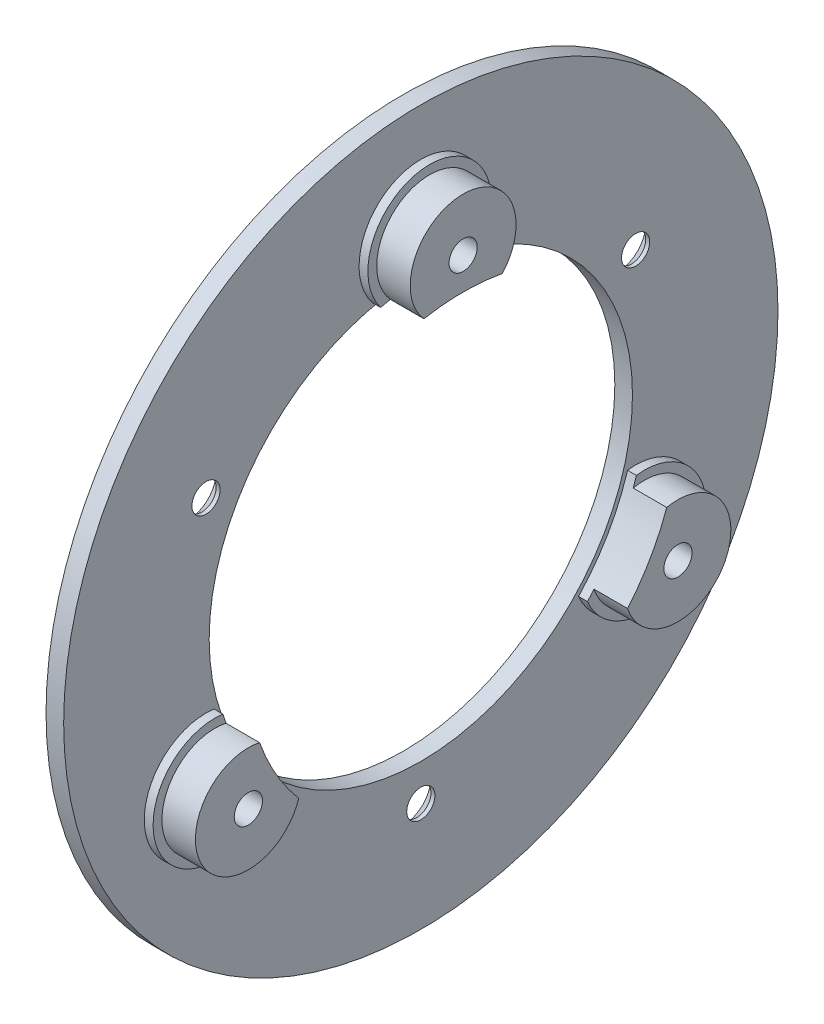
ISO-10303-21;
HEADER;
FILE_DESCRIPTION(('STEP AP214'),'2;1');
FILE_NAME('part.step','',(''),(''),'','','');
FILE_SCHEMA(('AUTOMOTIVE_DESIGN { 1 0 10303 214 1 1 1 1 }'));
ENDSEC;
DATA;
#1=APPLICATION_CONTEXT('core data for automotive mechanical design processes');
#2=APPLICATION_PROTOCOL_DEFINITION('international standard','automotive_design',2000,#1);
#3=PRODUCT_CONTEXT('',#1,'mechanical');
#4=PRODUCT('Part','Part','',(#3));
#5=PRODUCT_RELATED_PRODUCT_CATEGORY('part','',(#4));
#6=PRODUCT_DEFINITION_FORMATION('','',#4);
#7=PRODUCT_DEFINITION_CONTEXT('part definition',#1,'design');
#8=PRODUCT_DEFINITION('design','',#6,#7);
#9=PRODUCT_DEFINITION_SHAPE('','',#8);
#10=(LENGTH_UNIT() NAMED_UNIT(*) SI_UNIT(.MILLI.,.METRE.));
#11=(NAMED_UNIT(*) PLANE_ANGLE_UNIT() SI_UNIT($,.RADIAN.));
#12=(NAMED_UNIT(*) SI_UNIT($,.STERADIAN.) SOLID_ANGLE_UNIT());
#13=UNCERTAINTY_MEASURE_WITH_UNIT(LENGTH_MEASURE(1.E-05),#10,'distance_accuracy_value','');
#14=(GEOMETRIC_REPRESENTATION_CONTEXT(3) GLOBAL_UNCERTAINTY_ASSIGNED_CONTEXT((#13)) GLOBAL_UNIT_ASSIGNED_CONTEXT((#10,
#11,#12)) REPRESENTATION_CONTEXT('',''));
#15=CARTESIAN_POINT('',(0.,0.,0.));
#16=DIRECTION('',(0.,0.,1.));
#17=DIRECTION('',(1.,0.,0.));
#18=AXIS2_PLACEMENT_3D('',#15,#16,#17);
#19=CARTESIAN_POINT('',(-69.2964645562817,0.,0.));
#20=DIRECTION('',(1.,0.,0.));
#21=DIRECTION('',(0.,0.,-1.));
#22=AXIS2_PLACEMENT_3D('',#19,#20,#21);
#23=CYLINDRICAL_SURFACE('',#22,24.);
#24=CARTESIAN_POINT('',(0.,0.,0.));
#25=DIRECTION('',(-1.,0.,0.));
#26=DIRECTION('',(0.,0.,1.));
#27=AXIS2_PLACEMENT_3D('',#24,#25,#26);
#28=CIRCLE('',#27,24.);
#29=CARTESIAN_POINT('',(0.,0.,24.));
#30=VERTEX_POINT('',#29);
#31=EDGE_CURVE('E173',#30,#30,#28,.F.);
#32=ORIENTED_EDGE('',*,*,#31,.F.);
#33=EDGE_LOOP('',(#32));
#34=FACE_BOUND('',#33,.T.);
#35=CARTESIAN_POINT('',(2.,0.,0.));
#36=DIRECTION('',(1.,0.,0.));
#37=DIRECTION('',(0.,0.,-1.));
#38=AXIS2_PLACEMENT_3D('',#35,#36,#37);
#39=CIRCLE('',#38,24.);
#40=CARTESIAN_POINT('',(2.,0.,-24.));
#41=VERTEX_POINT('',#40);
#42=EDGE_CURVE('E265',#41,#41,#39,.F.);
#43=ORIENTED_EDGE('',*,*,#42,.F.);
#44=EDGE_LOOP('',(#43));
#45=FACE_BOUND('',#44,.T.);
#46=ADVANCED_FACE('F164',(#34,#45),#23,.F.);
#47=CARTESIAN_POINT('',(3.,14.0625,0.));
#48=DIRECTION('',(1.,0.,0.));
#49=DIRECTION('',(0.,0.,-1.));
#50=AXIS2_PLACEMENT_3D('',#47,#48,#49);
#51=PLANE('',#50);
#52=CARTESIAN_POINT('',(3.,-14.0625,-24.3569644814373));
#53=DIRECTION('',(1.,0.,0.));
#54=DIRECTION('',(0.,0.,-1.));
#55=AXIS2_PLACEMENT_3D('',#52,#53,#54);
#56=CIRCLE('',#55,7.);
#57=CARTESIAN_POINT('',(3.,-16.7399213666563,-17.8892434898227));
#58=VERTEX_POINT('',#57);
#59=CARTESIAN_POINT('',(3.,-7.12257863334373,-23.4418189057896));
#60=VERTEX_POINT('',#59);
#61=EDGE_CURVE('E288',#58,#60,#56,.T.);
#62=ORIENTED_EDGE('',*,*,#61,.T.);
#63=CARTESIAN_POINT('',(3.,0.,0.));
#64=DIRECTION('',(1.,0.,0.));
#65=DIRECTION('',(0.,0.,-1.));
#66=AXIS2_PLACEMENT_3D('',#63,#64,#65);
#67=CIRCLE('',#66,24.5);
#68=CARTESIAN_POINT('',(3.,-8.19830874252486,-23.0876099621039));
#69=VERTEX_POINT('',#68);
#70=EDGE_CURVE('E402',#60,#69,#67,.F.);
#71=ORIENTED_EDGE('',*,*,#70,.T.);
#72=CARTESIAN_POINT('',(3.,-14.0625,-24.3569644814373));
#73=DIRECTION('',(1.,0.,0.));
#74=DIRECTION('',(0.,0.,-1.));
#75=AXIS2_PLACEMENT_3D('',#72,#73,#74);
#76=CIRCLE('',#75,6.);
#77=CARTESIAN_POINT('',(3.,-15.8953023685863,-18.6437486201465));
#78=VERTEX_POINT('',#77);
#79=EDGE_CURVE('E285',#78,#69,#76,.T.);
#80=ORIENTED_EDGE('',*,*,#79,.F.);
#81=EDGE_CURVE('E405',#78,#58,#67,.F.);
#82=ORIENTED_EDGE('',*,*,#81,.T.);
#83=EDGE_LOOP('',(#62,#71,#80,#82));
#84=FACE_BOUND('',#83,.T.);
#85=ADVANCED_FACE('F393',(#84),#51,.T.);
#86=CARTESIAN_POINT('',(3.,-14.0625,24.3569644814373));
#87=DIRECTION('',(1.,0.,0.));
#88=DIRECTION('',(0.,0.,-1.));
#89=AXIS2_PLACEMENT_3D('',#86,#87,#88);
#90=CIRCLE('',#89,7.);
#91=CARTESIAN_POINT('',(3.,-7.12257863334372,23.4418189057896));
#92=VERTEX_POINT('',#91);
#93=CARTESIAN_POINT('',(3.,-16.7399213666563,17.8892434898227));
#94=VERTEX_POINT('',#93);
#95=EDGE_CURVE('E410',#92,#94,#90,.T.);
#96=ORIENTED_EDGE('',*,*,#95,.T.);
#97=CARTESIAN_POINT('',(3.,-15.8953023685863,18.6437486201465));
#98=VERTEX_POINT('',#97);
#99=EDGE_CURVE('E437',#94,#98,#67,.F.);
#100=ORIENTED_EDGE('',*,*,#99,.T.);
#101=CARTESIAN_POINT('',(3.,-14.0625,24.3569644814373));
#102=DIRECTION('',(1.,0.,0.));
#103=DIRECTION('',(0.,0.,-1.));
#104=AXIS2_PLACEMENT_3D('',#101,#102,#103);
#105=CIRCLE('',#104,6.);
#106=CARTESIAN_POINT('',(3.,-8.19830874252487,23.0876099621039));
#107=VERTEX_POINT('',#106);
#108=EDGE_CURVE('E404',#107,#98,#105,.T.);
#109=ORIENTED_EDGE('',*,*,#108,.F.);
#110=EDGE_CURVE('E434',#107,#92,#67,.F.);
#111=ORIENTED_EDGE('',*,*,#110,.T.);
#112=EDGE_LOOP('',(#96,#100,#109,#111));
#113=FACE_BOUND('',#112,.T.);
#114=ADVANCED_FACE('F436',(#113),#51,.T.);
#115=CARTESIAN_POINT('',(3.,28.125,0.));
#116=DIRECTION('',(1.,0.,0.));
#117=DIRECTION('',(0.,0.,-1.));
#118=AXIS2_PLACEMENT_3D('',#115,#116,#117);
#119=CIRCLE('',#118,7.);
#120=CARTESIAN_POINT('',(3.,23.8625,-5.5525754159669));
#121=VERTEX_POINT('',#120);
#122=CARTESIAN_POINT('',(3.,23.8625,5.5525754159669));
#123=VERTEX_POINT('',#122);
#124=EDGE_CURVE('E273',#121,#123,#119,.T.);
#125=ORIENTED_EDGE('',*,*,#124,.T.);
#126=CARTESIAN_POINT('',(3.,24.0936111111111,4.44386134195738));
#127=VERTEX_POINT('',#126);
#128=EDGE_CURVE('E400',#123,#127,#67,.F.);
#129=ORIENTED_EDGE('',*,*,#128,.T.);
#130=CARTESIAN_POINT('',(3.,28.125,0.));
#131=DIRECTION('',(1.,0.,0.));
#132=DIRECTION('',(0.,0.,-1.));
#133=AXIS2_PLACEMENT_3D('',#130,#131,#132);
#134=CIRCLE('',#133,6.);
#135=CARTESIAN_POINT('',(3.,24.0936111111111,-4.44386134195738));
#136=VERTEX_POINT('',#135);
#137=EDGE_CURVE('E279',#136,#127,#134,.T.);
#138=ORIENTED_EDGE('',*,*,#137,.F.);
#139=EDGE_CURVE('E398',#136,#121,#67,.F.);
#140=ORIENTED_EDGE('',*,*,#139,.T.);
#141=EDGE_LOOP('',(#125,#129,#138,#140));
#142=FACE_BOUND('',#141,.T.);
#143=ADVANCED_FACE('F440',(#142),#51,.T.);
#144=CARTESIAN_POINT('',(2.,0.,0.));
#145=DIRECTION('',(1.,0.,0.));
#146=DIRECTION('',(0.,0.,-1.));
#147=AXIS2_PLACEMENT_3D('',#144,#145,#146);
#148=PLANE('',#147);
#149=CARTESIAN_POINT('',(2.,28.125,0.));
#150=DIRECTION('',(1.,0.,0.));
#151=DIRECTION('',(0.,0.,-1.));
#152=AXIS2_PLACEMENT_3D('',#149,#150,#151);
#153=CIRCLE('',#152,7.);
#154=CARTESIAN_POINT('',(2.,23.8625,-5.5525754159669));
#155=VERTEX_POINT('',#154);
#156=CARTESIAN_POINT('',(2.,23.8625,5.5525754159669));
#157=VERTEX_POINT('',#156);
#158=EDGE_CURVE('E271',#155,#157,#153,.T.);
#159=ORIENTED_EDGE('',*,*,#158,.F.);
#160=CARTESIAN_POINT('',(2.,0.,0.));
#161=DIRECTION('',(1.,0.,0.));
#162=DIRECTION('',(0.,0.,-1.));
#163=AXIS2_PLACEMENT_3D('',#160,#161,#162);
#164=CIRCLE('',#163,24.5);
#165=EDGE_CURVE('E254',#155,#157,#164,.T.);
#166=ORIENTED_EDGE('',*,*,#165,.T.);
#167=EDGE_LOOP('',(#159,#166));
#168=FACE_BOUND('',#167,.T.);
#169=CARTESIAN_POINT('',(2.,-14.0625,24.3569644814373));
#170=DIRECTION('',(1.,0.,0.));
#171=DIRECTION('',(0.,0.,-1.));
#172=AXIS2_PLACEMENT_3D('',#169,#170,#171);
#173=CIRCLE('',#172,7.);
#174=CARTESIAN_POINT('',(2.,-7.12257863334373,23.4418189057896));
#175=VERTEX_POINT('',#174);
#176=CARTESIAN_POINT('',(2.,-16.7399213666563,17.8892434898227));
#177=VERTEX_POINT('',#176);
#178=EDGE_CURVE('E278',#175,#177,#173,.T.);
#179=ORIENTED_EDGE('',*,*,#178,.F.);
#180=EDGE_CURVE('E266',#175,#177,#164,.T.);
#181=ORIENTED_EDGE('',*,*,#180,.T.);
#182=EDGE_LOOP('',(#179,#181));
#183=FACE_BOUND('',#182,.T.);
#184=CARTESIAN_POINT('',(2.,14.0624999999999,24.3569644814374));
#185=DIRECTION('',(1.,0.,0.));
#186=DIRECTION('',(0.,0.,-1.));
#187=AXIS2_PLACEMENT_3D('',#184,#185,#186);
#188=CIRCLE('',#187,1.59999999999999);
#189=CARTESIAN_POINT('',(2.,14.0624999999999,22.7569644814374));
#190=VERTEX_POINT('',#189);
#191=EDGE_CURVE('E348',#190,#190,#188,.F.);
#192=ORIENTED_EDGE('',*,*,#191,.T.);
#193=EDGE_LOOP('',(#192));
#194=FACE_BOUND('',#193,.T.);
#195=CARTESIAN_POINT('',(2.,-28.125,0.));
#196=DIRECTION('',(1.,0.,0.));
#197=DIRECTION('',(0.,0.,-1.));
#198=AXIS2_PLACEMENT_3D('',#195,#196,#197);
#199=CIRCLE('',#198,1.59999999999999);
#200=CARTESIAN_POINT('',(2.,-28.125,-1.59999999999999));
#201=VERTEX_POINT('',#200);
#202=EDGE_CURVE('E345',#201,#201,#199,.F.);
#203=ORIENTED_EDGE('',*,*,#202,.T.);
#204=EDGE_LOOP('',(#203));
#205=FACE_BOUND('',#204,.T.);
#206=CARTESIAN_POINT('',(2.,14.0625000000003,-24.3569644814372));
#207=DIRECTION('',(1.,0.,0.));
#208=DIRECTION('',(0.,0.,-1.));
#209=AXIS2_PLACEMENT_3D('',#206,#207,#208);
#210=CIRCLE('',#209,1.59999999999999);
#211=CARTESIAN_POINT('',(2.,14.0625000000003,-25.9569644814372));
#212=VERTEX_POINT('',#211);
#213=EDGE_CURVE('E168',#212,#212,#210,.F.);
#214=ORIENTED_EDGE('',*,*,#213,.T.);
#215=EDGE_LOOP('',(#214));
#216=FACE_BOUND('',#215,.T.);
#217=CARTESIAN_POINT('',(2.,0.,0.));
#218=DIRECTION('',(1.,0.,0.));
#219=DIRECTION('',(0.,0.,-1.));
#220=AXIS2_PLACEMENT_3D('',#217,#218,#219);
#221=CIRCLE('',#220,40.5);
#222=CARTESIAN_POINT('',(2.,0.,-40.5));
#223=VERTEX_POINT('',#222);
#224=EDGE_CURVE('E342',#223,#223,#221,.T.);
#225=ORIENTED_EDGE('',*,*,#224,.T.);
#226=EDGE_LOOP('',(#225));
#227=FACE_BOUND('',#226,.T.);
#228=CARTESIAN_POINT('',(2.,-16.7399213666563,-17.8892434898227));
#229=VERTEX_POINT('',#228);
#230=CARTESIAN_POINT('',(2.,-7.12257863334373,-23.4418189057896));
#231=VERTEX_POINT('',#230);
#232=EDGE_CURVE('E180',#229,#231,#164,.T.);
#233=ORIENTED_EDGE('',*,*,#232,.T.);
#234=CARTESIAN_POINT('',(2.,-14.0625,-24.3569644814373));
#235=DIRECTION('',(1.,0.,0.));
#236=DIRECTION('',(0.,0.,-1.));
#237=AXIS2_PLACEMENT_3D('',#234,#235,#236);
#238=CIRCLE('',#237,7.);
#239=EDGE_CURVE('E282',#229,#231,#238,.T.);
#240=ORIENTED_EDGE('',*,*,#239,.F.);
#241=EDGE_LOOP('',(#233,#240));
#242=FACE_BOUND('',#241,.T.);
#243=ORIENTED_EDGE('',*,*,#42,.T.);
#244=EDGE_LOOP('',(#243));
#245=FACE_BOUND('',#244,.T.);
#246=ADVANCED_FACE('F276',(#168,#183,#194,#205,#216,#227,#242,#245),#148,.T.);
#247=CARTESIAN_POINT('',(3.,0.,0.));
#248=DIRECTION('',(-1.,0.,0.));
#249=DIRECTION('',(0.,0.,1.));
#250=AXIS2_PLACEMENT_3D('',#247,#248,#249);
#251=CYLINDRICAL_SURFACE('',#250,40.5);
#252=CARTESIAN_POINT('',(0.,0.,0.));
#253=DIRECTION('',(-1.,0.,0.));
#254=DIRECTION('',(0.,0.,1.));
#255=AXIS2_PLACEMENT_3D('',#252,#253,#254);
#256=CIRCLE('',#255,40.5);
#257=CARTESIAN_POINT('',(0.,0.,40.5));
#258=VERTEX_POINT('',#257);
#259=EDGE_CURVE('E12',#258,#258,#256,.T.);
#260=ORIENTED_EDGE('',*,*,#259,.F.);
#261=EDGE_LOOP('',(#260));
#262=FACE_BOUND('',#261,.T.);
#263=ORIENTED_EDGE('',*,*,#224,.F.);
#264=EDGE_LOOP('',(#263));
#265=FACE_BOUND('',#264,.T.);
#266=ADVANCED_FACE('F452',(#262,#265),#251,.T.);
#267=CARTESIAN_POINT('',(0.,28.125,0.));
#268=DIRECTION('',(-1.,0.,0.));
#269=DIRECTION('',(0.,0.,1.));
#270=AXIS2_PLACEMENT_3D('',#267,#268,#269);
#271=CYLINDRICAL_SURFACE('',#270,1.59999999999999);
#272=CARTESIAN_POINT('',(1.55,28.125,0.));
#273=DIRECTION('',(-1.,0.,0.));
#274=DIRECTION('',(0.,0.,1.));
#275=AXIS2_PLACEMENT_3D('',#272,#273,#274);
#276=CIRCLE('',#275,1.59999999999999);
#277=CARTESIAN_POINT('',(1.55,28.125,1.59999999999999));
#278=VERTEX_POINT('',#277);
#279=EDGE_CURVE('E382',#278,#278,#276,.T.);
#280=ORIENTED_EDGE('',*,*,#279,.T.);
#281=EDGE_LOOP('',(#280));
#282=FACE_BOUND('',#281,.T.);
#283=CARTESIAN_POINT('',(6.8,28.125,0.));
#284=DIRECTION('',(1.,0.,0.));
#285=DIRECTION('',(0.,0.,-1.));
#286=AXIS2_PLACEMENT_3D('',#283,#284,#285);
#287=CIRCLE('',#286,1.59999999999999);
#288=CARTESIAN_POINT('',(6.8,28.125,-1.59999999999999));
#289=VERTEX_POINT('',#288);
#290=EDGE_CURVE('E334',#289,#289,#287,.F.);
#291=ORIENTED_EDGE('',*,*,#290,.F.);
#292=EDGE_LOOP('',(#291));
#293=FACE_BOUND('',#292,.T.);
#294=ADVANCED_FACE('F449',(#282,#293),#271,.F.);
#295=CARTESIAN_POINT('',(0.,14.0624999999999,24.3569644814374));
#296=DIRECTION('',(-1.,0.,0.));
#297=DIRECTION('',(0.,0.,1.));
#298=AXIS2_PLACEMENT_3D('',#295,#296,#297);
#299=CYLINDRICAL_SURFACE('',#298,1.59999999999999);
#300=CARTESIAN_POINT('',(1.55,14.0624999999999,24.3569644814374));
#301=DIRECTION('',(-1.,0.,0.));
#302=DIRECTION('',(0.,0.,1.));
#303=AXIS2_PLACEMENT_3D('',#300,#301,#302);
#304=CIRCLE('',#303,1.59999999999999);
#305=CARTESIAN_POINT('',(1.55,14.0624999999999,25.9569644814374));
#306=VERTEX_POINT('',#305);
#307=EDGE_CURVE('E376',#306,#306,#304,.T.);
#308=ORIENTED_EDGE('',*,*,#307,.T.);
#309=EDGE_LOOP('',(#308));
#310=FACE_BOUND('',#309,.T.);
#311=ORIENTED_EDGE('',*,*,#191,.F.);
#312=EDGE_LOOP('',(#311));
#313=FACE_BOUND('',#312,.T.);
#314=ADVANCED_FACE('F451',(#310,#313),#299,.F.);
#315=CARTESIAN_POINT('',(0.,-14.0625000000001,24.3569644814373));
#316=DIRECTION('',(-1.,0.,0.));
#317=DIRECTION('',(0.,0.,1.));
#318=AXIS2_PLACEMENT_3D('',#315,#316,#317);
#319=CYLINDRICAL_SURFACE('',#318,1.59999999999999);
#320=CARTESIAN_POINT('',(1.55,-14.0625000000001,24.3569644814373));
#321=DIRECTION('',(-1.,0.,0.));
#322=DIRECTION('',(0.,0.,1.));
#323=AXIS2_PLACEMENT_3D('',#320,#321,#322);
#324=CIRCLE('',#323,1.59999999999999);
#325=CARTESIAN_POINT('',(1.55,-14.0625000000001,25.9569644814373));
#326=VERTEX_POINT('',#325);
#327=EDGE_CURVE('E370',#326,#326,#324,.T.);
#328=ORIENTED_EDGE('',*,*,#327,.T.);
#329=EDGE_LOOP('',(#328));
#330=FACE_BOUND('',#329,.T.);
#331=CARTESIAN_POINT('',(6.8,-14.0625000000001,24.3569644814373));
#332=DIRECTION('',(1.,0.,0.));
#333=DIRECTION('',(0.,0.,-1.));
#334=AXIS2_PLACEMENT_3D('',#331,#332,#333);
#335=CIRCLE('',#334,1.59999999999999);
#336=CARTESIAN_POINT('',(6.8,-14.0625000000001,22.7569644814373));
#337=VERTEX_POINT('',#336);
#338=EDGE_CURVE('E321',#337,#337,#335,.F.);
#339=ORIENTED_EDGE('',*,*,#338,.F.);
#340=EDGE_LOOP('',(#339));
#341=FACE_BOUND('',#340,.T.);
#342=ADVANCED_FACE('F459',(#330,#341),#319,.F.);
#343=CARTESIAN_POINT('',(0.,-28.125,0.));
#344=DIRECTION('',(-1.,0.,0.));
#345=DIRECTION('',(0.,0.,1.));
#346=AXIS2_PLACEMENT_3D('',#343,#344,#345);
#347=CYLINDRICAL_SURFACE('',#346,1.59999999999999);
#348=CARTESIAN_POINT('',(1.55,-28.125,0.));
#349=DIRECTION('',(-1.,0.,0.));
#350=DIRECTION('',(0.,0.,1.));
#351=AXIS2_PLACEMENT_3D('',#348,#349,#350);
#352=CIRCLE('',#351,1.59999999999999);
#353=CARTESIAN_POINT('',(1.55,-28.125,1.59999999999999));
#354=VERTEX_POINT('',#353);
#355=EDGE_CURVE('E364',#354,#354,#352,.T.);
#356=ORIENTED_EDGE('',*,*,#355,.T.);
#357=EDGE_LOOP('',(#356));
#358=FACE_BOUND('',#357,.T.);
#359=ORIENTED_EDGE('',*,*,#202,.F.);
#360=EDGE_LOOP('',(#359));
#361=FACE_BOUND('',#360,.T.);
#362=ADVANCED_FACE('F506',(#358,#361),#347,.F.);
#363=CARTESIAN_POINT('',(0.,-14.0624999999998,-24.3569644814375));
#364=DIRECTION('',(-1.,0.,0.));
#365=DIRECTION('',(0.,0.,1.));
#366=AXIS2_PLACEMENT_3D('',#363,#364,#365);
#367=CYLINDRICAL_SURFACE('',#366,1.59999999999999);
#368=CARTESIAN_POINT('',(1.55,-14.0624999999998,-24.3569644814375));
#369=DIRECTION('',(-1.,0.,0.));
#370=DIRECTION('',(0.,0.,1.));
#371=AXIS2_PLACEMENT_3D('',#368,#369,#370);
#372=CIRCLE('',#371,1.59999999999999);
#373=CARTESIAN_POINT('',(1.55,-14.0624999999998,-22.7569644814375));
#374=VERTEX_POINT('',#373);
#375=EDGE_CURVE('E358',#374,#374,#372,.T.);
#376=ORIENTED_EDGE('',*,*,#375,.T.);
#377=EDGE_LOOP('',(#376));
#378=FACE_BOUND('',#377,.T.);
#379=CARTESIAN_POINT('',(6.8,-14.0624999999998,-24.3569644814375));
#380=DIRECTION('',(1.,0.,0.));
#381=DIRECTION('',(0.,0.,-1.));
#382=AXIS2_PLACEMENT_3D('',#379,#380,#381);
#383=CIRCLE('',#382,1.59999999999999);
#384=CARTESIAN_POINT('',(6.8,-14.0624999999998,-25.9569644814375));
#385=VERTEX_POINT('',#384);
#386=EDGE_CURVE('E307',#385,#385,#383,.F.);
#387=ORIENTED_EDGE('',*,*,#386,.F.);
#388=EDGE_LOOP('',(#387));
#389=FACE_BOUND('',#388,.T.);
#390=ADVANCED_FACE('F497',(#378,#389),#367,.F.);
#391=CARTESIAN_POINT('',(0.,14.0625000000003,-24.3569644814372));
#392=DIRECTION('',(-1.,0.,0.));
#393=DIRECTION('',(0.,0.,1.));
#394=AXIS2_PLACEMENT_3D('',#391,#392,#393);
#395=CYLINDRICAL_SURFACE('',#394,1.59999999999999);
#396=CARTESIAN_POINT('',(1.55,14.0625000000003,-24.3569644814372));
#397=DIRECTION('',(-1.,0.,0.));
#398=DIRECTION('',(0.,0.,1.));
#399=AXIS2_PLACEMENT_3D('',#396,#397,#398);
#400=CIRCLE('',#399,1.59999999999999);
#401=CARTESIAN_POINT('',(1.55,14.0625000000003,-22.7569644814372));
#402=VERTEX_POINT('',#401);
#403=EDGE_CURVE('E352',#402,#402,#400,.T.);
#404=ORIENTED_EDGE('',*,*,#403,.T.);
#405=EDGE_LOOP('',(#404));
#406=FACE_BOUND('',#405,.T.);
#407=ORIENTED_EDGE('',*,*,#213,.F.);
#408=EDGE_LOOP('',(#407));
#409=FACE_BOUND('',#408,.T.);
#410=ADVANCED_FACE('F475',(#406,#409),#395,.F.);
#411=CARTESIAN_POINT('',(0.,36.25,0.));
#412=DIRECTION('',(-1.,0.,0.));
#413=DIRECTION('',(0.,-1.,0.));
#414=AXIS2_PLACEMENT_3D('',#411,#412,#413);
#415=PLANE('',#414);
#416=CARTESIAN_POINT('',(0.,14.0625000000003,-24.3569644814372));
#417=DIRECTION('',(-1.,0.,0.));
#418=DIRECTION('',(0.,0.,1.));
#419=AXIS2_PLACEMENT_3D('',#416,#417,#418);
#420=CIRCLE('',#419,3.15);
#421=CARTESIAN_POINT('',(0.,14.0625000000003,-21.2069644814372));
#422=VERTEX_POINT('',#421);
#423=EDGE_CURVE('E351',#422,#422,#420,.T.);
#424=ORIENTED_EDGE('',*,*,#423,.F.);
#425=EDGE_LOOP('',(#424));
#426=FACE_BOUND('',#425,.T.);
#427=CARTESIAN_POINT('',(0.,-14.0624999999998,-24.3569644814375));
#428=DIRECTION('',(-1.,0.,0.));
#429=DIRECTION('',(0.,0.,1.));
#430=AXIS2_PLACEMENT_3D('',#427,#428,#429);
#431=CIRCLE('',#430,3.15);
#432=CARTESIAN_POINT('',(0.,-14.0624999999998,-21.2069644814375));
#433=VERTEX_POINT('',#432);
#434=EDGE_CURVE('E355',#433,#433,#431,.T.);
#435=ORIENTED_EDGE('',*,*,#434,.F.);
#436=EDGE_LOOP('',(#435));
#437=FACE_BOUND('',#436,.T.);
#438=CARTESIAN_POINT('',(0.,-28.125,0.));
#439=DIRECTION('',(-1.,0.,0.));
#440=DIRECTION('',(0.,0.,1.));
#441=AXIS2_PLACEMENT_3D('',#438,#439,#440);
#442=CIRCLE('',#441,3.15);
#443=CARTESIAN_POINT('',(0.,-28.125,3.15));
#444=VERTEX_POINT('',#443);
#445=EDGE_CURVE('E361',#444,#444,#442,.T.);
#446=ORIENTED_EDGE('',*,*,#445,.F.);
#447=EDGE_LOOP('',(#446));
#448=FACE_BOUND('',#447,.T.);
#449=CARTESIAN_POINT('',(0.,-14.0625000000001,24.3569644814373));
#450=DIRECTION('',(-1.,0.,0.));
#451=DIRECTION('',(0.,0.,1.));
#452=AXIS2_PLACEMENT_3D('',#449,#450,#451);
#453=CIRCLE('',#452,3.15);
#454=CARTESIAN_POINT('',(0.,-14.0625000000001,27.5069644814373));
#455=VERTEX_POINT('',#454);
#456=EDGE_CURVE('E367',#455,#455,#453,.T.);
#457=ORIENTED_EDGE('',*,*,#456,.F.);
#458=EDGE_LOOP('',(#457));
#459=FACE_BOUND('',#458,.T.);
#460=CARTESIAN_POINT('',(0.,14.0624999999999,24.3569644814374));
#461=DIRECTION('',(-1.,0.,0.));
#462=DIRECTION('',(0.,0.,1.));
#463=AXIS2_PLACEMENT_3D('',#460,#461,#462);
#464=CIRCLE('',#463,3.15);
#465=CARTESIAN_POINT('',(0.,14.0624999999999,27.5069644814374));
#466=VERTEX_POINT('',#465);
#467=EDGE_CURVE('E373',#466,#466,#464,.T.);
#468=ORIENTED_EDGE('',*,*,#467,.F.);
#469=EDGE_LOOP('',(#468));
#470=FACE_BOUND('',#469,.T.);
#471=CARTESIAN_POINT('',(0.,28.125,0.));
#472=DIRECTION('',(-1.,0.,0.));
#473=DIRECTION('',(0.,0.,1.));
#474=AXIS2_PLACEMENT_3D('',#471,#472,#473);
#475=CIRCLE('',#474,3.15);
#476=CARTESIAN_POINT('',(0.,28.125,3.15));
#477=VERTEX_POINT('',#476);
#478=EDGE_CURVE('E379',#477,#477,#475,.T.);
#479=ORIENTED_EDGE('',*,*,#478,.F.);
#480=EDGE_LOOP('',(#479));
#481=FACE_BOUND('',#480,.T.);
#482=ORIENTED_EDGE('',*,*,#259,.T.);
#483=EDGE_LOOP('',(#482));
#484=FACE_BOUND('',#483,.T.);
#485=ORIENTED_EDGE('',*,*,#31,.T.);
#486=EDGE_LOOP('',(#485));
#487=FACE_BOUND('',#486,.T.);
#488=ADVANCED_FACE('F166',(#426,#437,#448,#459,#470,#481,#484,#487),#415,.T.);
#489=CARTESIAN_POINT('',(0.,28.125,0.));
#490=DIRECTION('',(-1.,0.,0.));
#491=DIRECTION('',(0.,0.,1.));
#492=AXIS2_PLACEMENT_3D('',#489,#490,#491);
#493=CONICAL_SURFACE('',#492,3.15,0.785398163397452);
#494=ORIENTED_EDGE('',*,*,#279,.F.);
#495=EDGE_LOOP('',(#494));
#496=FACE_BOUND('',#495,.T.);
#497=ORIENTED_EDGE('',*,*,#478,.T.);
#498=EDGE_LOOP('',(#497));
#499=FACE_BOUND('',#498,.T.);
#500=ADVANCED_FACE('F466',(#496,#499),#493,.F.);
#501=CARTESIAN_POINT('',(0.,14.0624999999999,24.3569644814374));
#502=DIRECTION('',(-1.,0.,0.));
#503=DIRECTION('',(0.,0.,1.));
#504=AXIS2_PLACEMENT_3D('',#501,#502,#503);
#505=CONICAL_SURFACE('',#504,3.15,0.785398163397452);
#506=ORIENTED_EDGE('',*,*,#307,.F.);
#507=EDGE_LOOP('',(#506));
#508=FACE_BOUND('',#507,.T.);
#509=ORIENTED_EDGE('',*,*,#467,.T.);
#510=EDGE_LOOP('',(#509));
#511=FACE_BOUND('',#510,.T.);
#512=ADVANCED_FACE('F465',(#508,#511),#505,.F.);
#513=CARTESIAN_POINT('',(0.,-14.0625000000001,24.3569644814373));
#514=DIRECTION('',(-1.,0.,0.));
#515=DIRECTION('',(0.,0.,1.));
#516=AXIS2_PLACEMENT_3D('',#513,#514,#515);
#517=CONICAL_SURFACE('',#516,3.15,0.785398163397453);
#518=ORIENTED_EDGE('',*,*,#327,.F.);
#519=EDGE_LOOP('',(#518));
#520=FACE_BOUND('',#519,.T.);
#521=ORIENTED_EDGE('',*,*,#456,.T.);
#522=EDGE_LOOP('',(#521));
#523=FACE_BOUND('',#522,.T.);
#524=ADVANCED_FACE('F473',(#520,#523),#517,.F.);
#525=CARTESIAN_POINT('',(0.,-28.125,0.));
#526=DIRECTION('',(-1.,0.,0.));
#527=DIRECTION('',(0.,0.,1.));
#528=AXIS2_PLACEMENT_3D('',#525,#526,#527);
#529=CONICAL_SURFACE('',#528,3.15,0.785398163397453);
#530=ORIENTED_EDGE('',*,*,#355,.F.);
#531=EDGE_LOOP('',(#530));
#532=FACE_BOUND('',#531,.T.);
#533=ORIENTED_EDGE('',*,*,#445,.T.);
#534=EDGE_LOOP('',(#533));
#535=FACE_BOUND('',#534,.T.);
#536=ADVANCED_FACE('F510',(#532,#535),#529,.F.);
#537=CARTESIAN_POINT('',(0.,-14.0624999999998,-24.3569644814375));
#538=DIRECTION('',(-1.,0.,0.));
#539=DIRECTION('',(0.,0.,1.));
#540=AXIS2_PLACEMENT_3D('',#537,#538,#539);
#541=CONICAL_SURFACE('',#540,3.15,0.785398163397453);
#542=ORIENTED_EDGE('',*,*,#375,.F.);
#543=EDGE_LOOP('',(#542));
#544=FACE_BOUND('',#543,.T.);
#545=ORIENTED_EDGE('',*,*,#434,.T.);
#546=EDGE_LOOP('',(#545));
#547=FACE_BOUND('',#546,.T.);
#548=ADVANCED_FACE('F502',(#544,#547),#541,.F.);
#549=CARTESIAN_POINT('',(0.,14.0625000000003,-24.3569644814372));
#550=DIRECTION('',(-1.,0.,0.));
#551=DIRECTION('',(0.,0.,1.));
#552=AXIS2_PLACEMENT_3D('',#549,#550,#551);
#553=CONICAL_SURFACE('',#552,3.15,0.785398163397452);
#554=ORIENTED_EDGE('',*,*,#403,.F.);
#555=EDGE_LOOP('',(#554));
#556=FACE_BOUND('',#555,.T.);
#557=ORIENTED_EDGE('',*,*,#423,.T.);
#558=EDGE_LOOP('',(#557));
#559=FACE_BOUND('',#558,.T.);
#560=ADVANCED_FACE('F499',(#556,#559),#553,.F.);
#561=CARTESIAN_POINT('',(6.8,0.,0.));
#562=DIRECTION('',(-1.,0.,0.));
#563=DIRECTION('',(0.,0.,1.));
#564=AXIS2_PLACEMENT_3D('',#561,#562,#563);
#565=CYLINDRICAL_SURFACE('',#564,24.5);
#566=DIRECTION('',(-1.,0.,0.));
#567=VECTOR('',#566,1.);
#568=CARTESIAN_POINT('',(6.8,24.0936111111111,4.44386134195738));
#569=LINE('',#568,#567);
#570=CARTESIAN_POINT('',(6.8,24.0936111111111,4.44386134195738));
#571=VERTEX_POINT('',#570);
#572=EDGE_CURVE('E337',#571,#127,#569,.T.);
#573=ORIENTED_EDGE('',*,*,#572,.T.);
#574=ORIENTED_EDGE('',*,*,#128,.F.);
#575=DIRECTION('',(-1.,0.,0.));
#576=VECTOR('',#575,1.);
#577=CARTESIAN_POINT('',(3.,23.8625,5.5525754159669));
#578=LINE('',#577,#576);
#579=EDGE_CURVE('E261',#123,#157,#578,.T.);
#580=ORIENTED_EDGE('',*,*,#579,.T.);
#581=ORIENTED_EDGE('',*,*,#165,.F.);
#582=DIRECTION('',(-1.,0.,0.));
#583=VECTOR('',#582,1.);
#584=CARTESIAN_POINT('',(3.,23.8625,-5.5525754159669));
#585=LINE('',#584,#583);
#586=EDGE_CURVE('E258',#121,#155,#585,.T.);
#587=ORIENTED_EDGE('',*,*,#586,.F.);
#588=ORIENTED_EDGE('',*,*,#139,.F.);
#589=DIRECTION('',(-1.,0.,0.));
#590=VECTOR('',#589,1.);
#591=CARTESIAN_POINT('',(6.8,24.0936111111111,-4.44386134195737));
#592=LINE('',#591,#590);
#593=CARTESIAN_POINT('',(6.8,24.0936111111111,-4.44386134195737));
#594=VERTEX_POINT('',#593);
#595=EDGE_CURVE('E339',#594,#136,#592,.T.);
#596=ORIENTED_EDGE('',*,*,#595,.F.);
#597=CARTESIAN_POINT('',(6.8,0.,0.));
#598=DIRECTION('',(1.,0.,0.));
#599=DIRECTION('',(0.,0.,-1.));
#600=AXIS2_PLACEMENT_3D('',#597,#598,#599);
#601=CIRCLE('',#600,24.5);
#602=EDGE_CURVE('E330',#594,#571,#601,.T.);
#603=ORIENTED_EDGE('',*,*,#602,.T.);
#604=EDGE_LOOP('',(#573,#574,#580,#581,#587,#588,#596,#603));
#605=FACE_BOUND('',#604,.T.);
#606=ADVANCED_FACE('F257',(#605),#565,.F.);
#607=CARTESIAN_POINT('',(6.8,28.125,0.));
#608=DIRECTION('',(-1.,0.,0.));
#609=DIRECTION('',(0.,0.,1.));
#610=AXIS2_PLACEMENT_3D('',#607,#608,#609);
#611=CYLINDRICAL_SURFACE('',#610,6.);
#612=ORIENTED_EDGE('',*,*,#595,.T.);
#613=ORIENTED_EDGE('',*,*,#137,.T.);
#614=ORIENTED_EDGE('',*,*,#572,.F.);
#615=CARTESIAN_POINT('',(6.8,28.125,0.));
#616=DIRECTION('',(1.,0.,0.));
#617=DIRECTION('',(0.,0.,-1.));
#618=AXIS2_PLACEMENT_3D('',#615,#616,#617);
#619=CIRCLE('',#618,6.);
#620=EDGE_CURVE('E187',#594,#571,#619,.T.);
#621=ORIENTED_EDGE('',*,*,#620,.F.);
#622=EDGE_LOOP('',(#612,#613,#614,#621));
#623=FACE_BOUND('',#622,.T.);
#624=ADVANCED_FACE('F442',(#623),#611,.T.);
#625=CARTESIAN_POINT('',(6.8,0.,0.));
#626=DIRECTION('',(1.,0.,0.));
#627=DIRECTION('',(0.,0.,-1.));
#628=AXIS2_PLACEMENT_3D('',#625,#626,#627);
#629=PLANE('',#628);
#630=ORIENTED_EDGE('',*,*,#602,.F.);
#631=ORIENTED_EDGE('',*,*,#620,.T.);
#632=EDGE_LOOP('',(#630,#631));
#633=FACE_BOUND('',#632,.T.);
#634=ORIENTED_EDGE('',*,*,#290,.T.);
#635=EDGE_LOOP('',(#634));
#636=FACE_BOUND('',#635,.T.);
#637=ADVANCED_FACE('F443',(#633,#636),#629,.T.);
#638=CARTESIAN_POINT('',(6.8,0.,0.));
#639=DIRECTION('',(-1.,0.,0.));
#640=DIRECTION('',(0.,0.,1.));
#641=AXIS2_PLACEMENT_3D('',#638,#639,#640);
#642=CYLINDRICAL_SURFACE('',#641,24.5);
#643=DIRECTION('',(-1.,0.,0.));
#644=VECTOR('',#643,1.);
#645=CARTESIAN_POINT('',(6.8,-15.8953023685863,18.6437486201465));
#646=LINE('',#645,#644);
#647=CARTESIAN_POINT('',(6.8,-15.8953023685863,18.6437486201465));
#648=VERTEX_POINT('',#647);
#649=EDGE_CURVE('E324',#648,#98,#646,.T.);
#650=ORIENTED_EDGE('',*,*,#649,.T.);
#651=ORIENTED_EDGE('',*,*,#99,.F.);
#652=DIRECTION('',(-1.,0.,0.));
#653=VECTOR('',#652,1.);
#654=CARTESIAN_POINT('',(3.,-16.7399213666563,17.8892434898227));
#655=LINE('',#654,#653);
#656=EDGE_CURVE('E297',#94,#177,#655,.T.);
#657=ORIENTED_EDGE('',*,*,#656,.T.);
#658=ORIENTED_EDGE('',*,*,#180,.F.);
#659=DIRECTION('',(-1.,0.,0.));
#660=VECTOR('',#659,1.);
#661=CARTESIAN_POINT('',(3.,-7.12257863334373,23.4418189057896));
#662=LINE('',#661,#660);
#663=EDGE_CURVE('E299',#92,#175,#662,.T.);
#664=ORIENTED_EDGE('',*,*,#663,.F.);
#665=ORIENTED_EDGE('',*,*,#110,.F.);
#666=DIRECTION('',(-1.,0.,0.));
#667=VECTOR('',#666,1.);
#668=CARTESIAN_POINT('',(6.8,-8.19830874252487,23.0876099621039));
#669=LINE('',#668,#667);
#670=CARTESIAN_POINT('',(6.8,-8.19830874252487,23.0876099621039));
#671=VERTEX_POINT('',#670);
#672=EDGE_CURVE('E327',#671,#107,#669,.T.);
#673=ORIENTED_EDGE('',*,*,#672,.F.);
#674=CARTESIAN_POINT('',(6.8,0.,0.));
#675=DIRECTION('',(1.,0.,0.));
#676=DIRECTION('',(0.,0.,-1.));
#677=AXIS2_PLACEMENT_3D('',#674,#675,#676);
#678=CIRCLE('',#677,24.5);
#679=EDGE_CURVE('E316',#671,#648,#678,.T.);
#680=ORIENTED_EDGE('',*,*,#679,.T.);
#681=EDGE_LOOP('',(#650,#651,#657,#658,#664,#665,#673,#680));
#682=FACE_BOUND('',#681,.T.);
#683=ADVANCED_FACE('F433',(#682),#642,.F.);
#684=CARTESIAN_POINT('',(6.8,-14.0625,24.3569644814373));
#685=DIRECTION('',(-1.,0.,0.));
#686=DIRECTION('',(0.,0.,1.));
#687=AXIS2_PLACEMENT_3D('',#684,#685,#686);
#688=CYLINDRICAL_SURFACE('',#687,6.);
#689=ORIENTED_EDGE('',*,*,#672,.T.);
#690=ORIENTED_EDGE('',*,*,#108,.T.);
#691=ORIENTED_EDGE('',*,*,#649,.F.);
#692=CARTESIAN_POINT('',(6.8,-14.0625,24.3569644814373));
#693=DIRECTION('',(1.,0.,0.));
#694=DIRECTION('',(0.,0.,-1.));
#695=AXIS2_PLACEMENT_3D('',#692,#693,#694);
#696=CIRCLE('',#695,6.);
#697=EDGE_CURVE('E319',#671,#648,#696,.T.);
#698=ORIENTED_EDGE('',*,*,#697,.F.);
#699=EDGE_LOOP('',(#689,#690,#691,#698));
#700=FACE_BOUND('',#699,.T.);
#701=ADVANCED_FACE('F537',(#700),#688,.T.);
#702=CARTESIAN_POINT('',(6.8,0.,0.));
#703=DIRECTION('',(1.,0.,0.));
#704=DIRECTION('',(0.,0.,-1.));
#705=AXIS2_PLACEMENT_3D('',#702,#703,#704);
#706=PLANE('',#705);
#707=ORIENTED_EDGE('',*,*,#679,.F.);
#708=ORIENTED_EDGE('',*,*,#697,.T.);
#709=EDGE_LOOP('',(#707,#708));
#710=FACE_BOUND('',#709,.T.);
#711=ORIENTED_EDGE('',*,*,#338,.T.);
#712=EDGE_LOOP('',(#711));
#713=FACE_BOUND('',#712,.T.);
#714=ADVANCED_FACE('F535',(#710,#713),#706,.T.);
#715=CARTESIAN_POINT('',(6.8,0.,0.));
#716=DIRECTION('',(-1.,0.,0.));
#717=DIRECTION('',(0.,0.,1.));
#718=AXIS2_PLACEMENT_3D('',#715,#716,#717);
#719=CYLINDRICAL_SURFACE('',#718,24.5);
#720=DIRECTION('',(-1.,0.,0.));
#721=VECTOR('',#720,1.);
#722=CARTESIAN_POINT('',(6.8,-8.19830874252486,-23.0876099621039));
#723=LINE('',#722,#721);
#724=CARTESIAN_POINT('',(6.8,-8.19830874252486,-23.0876099621039));
#725=VERTEX_POINT('',#724);
#726=EDGE_CURVE('E310',#725,#69,#723,.T.);
#727=ORIENTED_EDGE('',*,*,#726,.T.);
#728=ORIENTED_EDGE('',*,*,#70,.F.);
#729=DIRECTION('',(-1.,0.,0.));
#730=VECTOR('',#729,1.);
#731=CARTESIAN_POINT('',(3.,-7.12257863334373,-23.4418189057896));
#732=LINE('',#731,#730);
#733=EDGE_CURVE('E293',#60,#231,#732,.T.);
#734=ORIENTED_EDGE('',*,*,#733,.T.);
#735=ORIENTED_EDGE('',*,*,#232,.F.);
#736=DIRECTION('',(-1.,0.,0.));
#737=VECTOR('',#736,1.);
#738=CARTESIAN_POINT('',(3.,-16.7399213666563,-17.8892434898227));
#739=LINE('',#738,#737);
#740=EDGE_CURVE('E295',#58,#229,#739,.T.);
#741=ORIENTED_EDGE('',*,*,#740,.F.);
#742=ORIENTED_EDGE('',*,*,#81,.F.);
#743=DIRECTION('',(-1.,0.,0.));
#744=VECTOR('',#743,1.);
#745=CARTESIAN_POINT('',(6.8,-15.8953023685862,-18.6437486201466));
#746=LINE('',#745,#744);
#747=CARTESIAN_POINT('',(6.8,-15.8953023685862,-18.6437486201466));
#748=VERTEX_POINT('',#747);
#749=EDGE_CURVE('E313',#748,#78,#746,.T.);
#750=ORIENTED_EDGE('',*,*,#749,.F.);
#751=CARTESIAN_POINT('',(6.8,0.,0.));
#752=DIRECTION('',(1.,0.,0.));
#753=DIRECTION('',(0.,0.,-1.));
#754=AXIS2_PLACEMENT_3D('',#751,#752,#753);
#755=CIRCLE('',#754,24.5);
#756=EDGE_CURVE('E274',#748,#725,#755,.T.);
#757=ORIENTED_EDGE('',*,*,#756,.T.);
#758=EDGE_LOOP('',(#727,#728,#734,#735,#741,#742,#750,#757));
#759=FACE_BOUND('',#758,.T.);
#760=ADVANCED_FACE('F425',(#759),#719,.F.);
#761=CARTESIAN_POINT('',(6.8,-14.0625,-24.3569644814373));
#762=DIRECTION('',(-1.,0.,0.));
#763=DIRECTION('',(0.,0.,1.));
#764=AXIS2_PLACEMENT_3D('',#761,#762,#763);
#765=CYLINDRICAL_SURFACE('',#764,6.);
#766=ORIENTED_EDGE('',*,*,#749,.T.);
#767=ORIENTED_EDGE('',*,*,#79,.T.);
#768=ORIENTED_EDGE('',*,*,#726,.F.);
#769=CARTESIAN_POINT('',(6.8,-14.0625,-24.3569644814373));
#770=DIRECTION('',(1.,0.,0.));
#771=DIRECTION('',(0.,0.,-1.));
#772=AXIS2_PLACEMENT_3D('',#769,#770,#771);
#773=CIRCLE('',#772,6.);
#774=EDGE_CURVE('E305',#748,#725,#773,.T.);
#775=ORIENTED_EDGE('',*,*,#774,.F.);
#776=EDGE_LOOP('',(#766,#767,#768,#775));
#777=FACE_BOUND('',#776,.T.);
#778=ADVANCED_FACE('F544',(#777),#765,.T.);
#779=CARTESIAN_POINT('',(6.8,0.,0.));
#780=DIRECTION('',(1.,0.,0.));
#781=DIRECTION('',(0.,0.,-1.));
#782=AXIS2_PLACEMENT_3D('',#779,#780,#781);
#783=PLANE('',#782);
#784=ORIENTED_EDGE('',*,*,#756,.F.);
#785=ORIENTED_EDGE('',*,*,#774,.T.);
#786=EDGE_LOOP('',(#784,#785));
#787=FACE_BOUND('',#786,.T.);
#788=ORIENTED_EDGE('',*,*,#386,.T.);
#789=EDGE_LOOP('',(#788));
#790=FACE_BOUND('',#789,.T.);
#791=ADVANCED_FACE('F715',(#787,#790),#783,.T.);
#792=CARTESIAN_POINT('',(3.,28.125,0.));
#793=DIRECTION('',(-1.,0.,0.));
#794=DIRECTION('',(0.,0.,1.));
#795=AXIS2_PLACEMENT_3D('',#792,#793,#794);
#796=CYLINDRICAL_SURFACE('',#795,7.);
#797=ORIENTED_EDGE('',*,*,#158,.T.);
#798=ORIENTED_EDGE('',*,*,#579,.F.);
#799=ORIENTED_EDGE('',*,*,#124,.F.);
#800=ORIENTED_EDGE('',*,*,#586,.T.);
#801=EDGE_LOOP('',(#797,#798,#799,#800));
#802=FACE_BOUND('',#801,.T.);
#803=ADVANCED_FACE('F270',(#802),#796,.T.);
#804=CARTESIAN_POINT('',(3.,-14.0625,24.3569644814373));
#805=DIRECTION('',(-1.,0.,0.));
#806=DIRECTION('',(0.,0.,1.));
#807=AXIS2_PLACEMENT_3D('',#804,#805,#806);
#808=CYLINDRICAL_SURFACE('',#807,7.);
#809=ORIENTED_EDGE('',*,*,#178,.T.);
#810=ORIENTED_EDGE('',*,*,#656,.F.);
#811=ORIENTED_EDGE('',*,*,#95,.F.);
#812=ORIENTED_EDGE('',*,*,#663,.T.);
#813=EDGE_LOOP('',(#809,#810,#811,#812));
#814=FACE_BOUND('',#813,.T.);
#815=ADVANCED_FACE('F432',(#814),#808,.T.);
#816=CARTESIAN_POINT('',(3.,-14.0625,-24.3569644814373));
#817=DIRECTION('',(-1.,0.,0.));
#818=DIRECTION('',(0.,0.,1.));
#819=AXIS2_PLACEMENT_3D('',#816,#817,#818);
#820=CYLINDRICAL_SURFACE('',#819,7.);
#821=ORIENTED_EDGE('',*,*,#239,.T.);
#822=ORIENTED_EDGE('',*,*,#733,.F.);
#823=ORIENTED_EDGE('',*,*,#61,.F.);
#824=ORIENTED_EDGE('',*,*,#740,.T.);
#825=EDGE_LOOP('',(#821,#822,#823,#824));
#826=FACE_BOUND('',#825,.T.);
#827=ADVANCED_FACE('F423',(#826),#820,.T.);
#828=CLOSED_SHELL('',(#46,#85,#114,#143,#246,#266,#294,#314,#342,#362,#390,#410,#488,#500,#512,
#524,#536,#548,#560,#606,#624,#637,#683,#701,#714,#760,#778,#791,#803,#815,#827));
#829=MANIFOLD_SOLID_BREP('B2',#828);
#830=ADVANCED_BREP_SHAPE_REPRESENTATION('',(#18,#829),#14);
#831=SHAPE_DEFINITION_REPRESENTATION(#9,#830);
ENDSEC;
END-ISO-10303-21;
